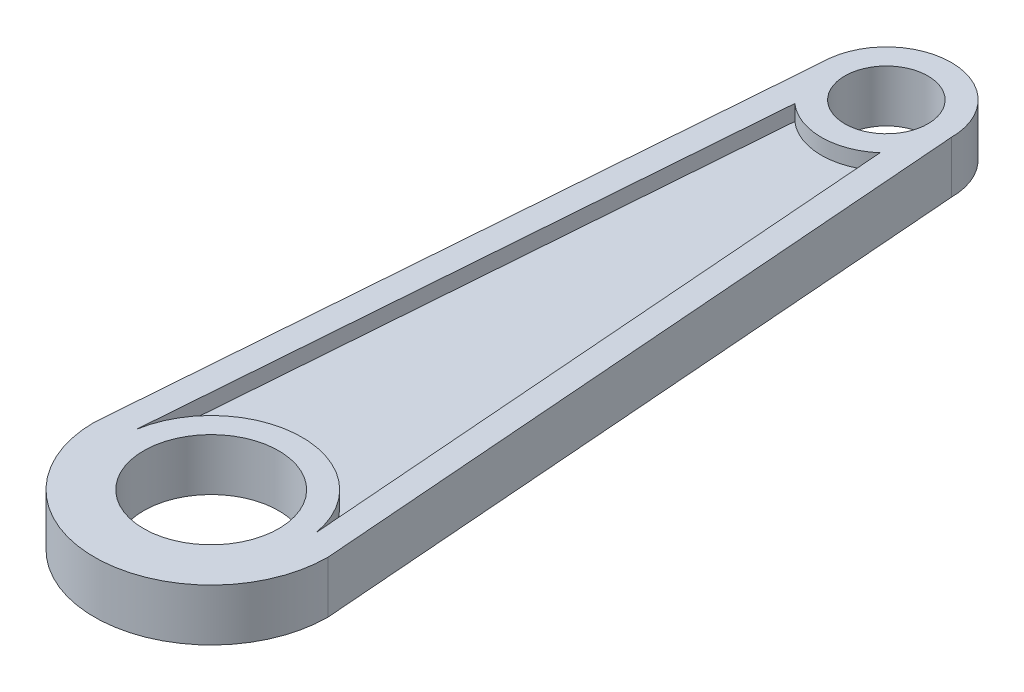
ISO-10303-21;
HEADER;
FILE_DESCRIPTION(('STEP AP214'),'2;1');
FILE_NAME('part.step','',(''),(''),'','','');
FILE_SCHEMA(('AUTOMOTIVE_DESIGN { 1 0 10303 214 1 1 1 1 }'));
ENDSEC;
DATA;
#1=APPLICATION_CONTEXT('core data for automotive mechanical design processes');
#2=APPLICATION_PROTOCOL_DEFINITION('international standard','automotive_design',2000,#1);
#3=PRODUCT_CONTEXT('',#1,'mechanical');
#4=PRODUCT('Part','Part','',(#3));
#5=PRODUCT_RELATED_PRODUCT_CATEGORY('part','',(#4));
#6=PRODUCT_DEFINITION_FORMATION('','',#4);
#7=PRODUCT_DEFINITION_CONTEXT('part definition',#1,'design');
#8=PRODUCT_DEFINITION('design','',#6,#7);
#9=PRODUCT_DEFINITION_SHAPE('','',#8);
#10=(LENGTH_UNIT() NAMED_UNIT(*) SI_UNIT(.MILLI.,.METRE.));
#11=(NAMED_UNIT(*) PLANE_ANGLE_UNIT() SI_UNIT($,.RADIAN.));
#12=(NAMED_UNIT(*) SI_UNIT($,.STERADIAN.) SOLID_ANGLE_UNIT());
#13=UNCERTAINTY_MEASURE_WITH_UNIT(LENGTH_MEASURE(1.E-05),#10,'distance_accuracy_value','');
#14=(GEOMETRIC_REPRESENTATION_CONTEXT(3) GLOBAL_UNCERTAINTY_ASSIGNED_CONTEXT((#13)) GLOBAL_UNIT_ASSIGNED_CONTEXT((#10,
#11,#12)) REPRESENTATION_CONTEXT('',''));
#15=CARTESIAN_POINT('',(0.,0.,0.));
#16=DIRECTION('',(0.,0.,1.));
#17=DIRECTION('',(1.,0.,0.));
#18=AXIS2_PLACEMENT_3D('',#15,#16,#17);
#19=CARTESIAN_POINT('',(0.,5.,0.));
#20=DIRECTION('',(0.,1.,0.));
#21=DIRECTION('',(0.,0.,1.));
#22=AXIS2_PLACEMENT_3D('',#19,#20,#21);
#23=PLANE('',#22);
#24=CARTESIAN_POINT('',(0.,5.,-130.));
#25=DIRECTION('',(0.,1.,0.));
#26=DIRECTION('',(0.,0.,1.));
#27=AXIS2_PLACEMENT_3D('',#24,#25,#26);
#28=CIRCLE('',#27,12.5);
#29=CARTESIAN_POINT('',(12.5,5.,-130.));
#30=VERTEX_POINT('',#29);
#31=CARTESIAN_POINT('',(-12.5,5.,-130.));
#32=VERTEX_POINT('',#31);
#33=EDGE_CURVE('E179',#30,#32,#28,.T.);
#34=ORIENTED_EDGE('',*,*,#33,.T.);
#35=DIRECTION('',(0.076696498884737,0.,-0.997054485501582));
#36=VECTOR('',#35,1.);
#37=CARTESIAN_POINT('',(-22.3676470588235,5.,-1.72058823529412));
#38=LINE('',#37,#36);
#39=CARTESIAN_POINT('',(-22.5,5.,0.));
#40=VERTEX_POINT('',#39);
#41=EDGE_CURVE('E181',#40,#32,#38,.T.);
#42=ORIENTED_EDGE('',*,*,#41,.F.);
#43=CARTESIAN_POINT('',(0.,5.,0.));
#44=DIRECTION('',(0.,1.,0.));
#45=DIRECTION('',(0.,0.,1.));
#46=AXIS2_PLACEMENT_3D('',#43,#44,#45);
#47=CIRCLE('',#46,22.5);
#48=CARTESIAN_POINT('',(22.5,5.,0.));
#49=VERTEX_POINT('',#48);
#50=EDGE_CURVE('E185',#40,#49,#47,.T.);
#51=ORIENTED_EDGE('',*,*,#50,.T.);
#52=DIRECTION('',(-0.076696498884737,0.,-0.997054485501582));
#53=VECTOR('',#52,1.);
#54=CARTESIAN_POINT('',(22.3676470588235,5.,-1.72058823529412));
#55=LINE('',#54,#53);
#56=EDGE_CURVE('E187',#49,#30,#55,.T.);
#57=ORIENTED_EDGE('',*,*,#56,.T.);
#58=EDGE_LOOP('',(#34,#42,#51,#57));
#59=FACE_BOUND('',#58,.T.);
#60=CARTESIAN_POINT('',(0.,5.,0.));
#61=DIRECTION('',(0.,1.,0.));
#62=DIRECTION('',(0.,0.,1.));
#63=AXIS2_PLACEMENT_3D('',#60,#61,#62);
#64=CIRCLE('',#63,13.);
#65=CARTESIAN_POINT('',(0.,5.,13.));
#66=VERTEX_POINT('',#65);
#67=EDGE_CURVE('E189',#66,#66,#64,.T.);
#68=ORIENTED_EDGE('',*,*,#67,.F.);
#69=EDGE_LOOP('',(#68));
#70=FACE_BOUND('',#69,.T.);
#71=CARTESIAN_POINT('',(0.,5.,-130.));
#72=DIRECTION('',(0.,1.,0.));
#73=DIRECTION('',(0.,0.,1.));
#74=AXIS2_PLACEMENT_3D('',#71,#72,#73);
#75=CIRCLE('',#74,8.);
#76=CARTESIAN_POINT('',(0.,5.,-122.));
#77=VERTEX_POINT('',#76);
#78=EDGE_CURVE('E192',#77,#77,#75,.T.);
#79=ORIENTED_EDGE('',*,*,#78,.F.);
#80=EDGE_LOOP('',(#79));
#81=FACE_BOUND('',#80,.T.);
#82=CARTESIAN_POINT('',(0.,5.,-130.));
#83=DIRECTION('',(0.,1.,0.));
#84=DIRECTION('',(0.,0.,1.));
#85=AXIS2_PLACEMENT_3D('',#82,#83,#84);
#86=CIRCLE('',#85,12.5);
#87=CARTESIAN_POINT('',(-8.21027296139896,5.,-120.574427449787));
#88=VERTEX_POINT('',#87);
#89=CARTESIAN_POINT('',(8.21027296139896,5.,-120.574427449787));
#90=VERTEX_POINT('',#89);
#91=EDGE_CURVE('E139',#88,#90,#86,.T.);
#92=ORIENTED_EDGE('',*,*,#91,.T.);
#93=DIRECTION('',(0.076696498884737,0.,0.997054485501582));
#94=VECTOR('',#93,1.);
#95=CARTESIAN_POINT('',(17.3823746313156,5.,-1.33710574087043));
#96=LINE('',#95,#94);
#97=CARTESIAN_POINT('',(17.2656749056663,5.,-2.85420217431153));
#98=VERTEX_POINT('',#97);
#99=EDGE_CURVE('E50',#90,#98,#96,.T.);
#100=ORIENTED_EDGE('',*,*,#99,.T.);
#101=CARTESIAN_POINT('',(0.,5.,0.));
#102=DIRECTION('',(0.,1.,0.));
#103=DIRECTION('',(0.,0.,1.));
#104=AXIS2_PLACEMENT_3D('',#101,#102,#103);
#105=CIRCLE('',#104,17.5);
#106=CARTESIAN_POINT('',(-17.2656749056663,5.,-2.85420217431153));
#107=VERTEX_POINT('',#106);
#108=EDGE_CURVE('E143',#98,#107,#105,.T.);
#109=ORIENTED_EDGE('',*,*,#108,.T.);
#110=DIRECTION('',(0.076696498884737,0.,-0.997054485501582));
#111=VECTOR('',#110,1.);
#112=CARTESIAN_POINT('',(-17.3823746313156,5.,-1.33710574087043));
#113=LINE('',#112,#111);
#114=EDGE_CURVE('E247',#107,#88,#113,.T.);
#115=ORIENTED_EDGE('',*,*,#114,.T.);
#116=EDGE_LOOP('',(#92,#100,#109,#115));
#117=FACE_BOUND('',#116,.T.);
#118=ADVANCED_FACE('F35',(#59,#70,#81,#117),#23,.T.);
#119=CARTESIAN_POINT('',(0.,5.,-130.));
#120=DIRECTION('',(0.,-1.,0.));
#121=DIRECTION('',(0.,0.,-1.));
#122=AXIS2_PLACEMENT_3D('',#119,#120,#121);
#123=CYLINDRICAL_SURFACE('',#122,12.5);
#124=CARTESIAN_POINT('',(0.,-5.,-130.));
#125=DIRECTION('',(0.,1.,0.));
#126=DIRECTION('',(0.,0.,1.));
#127=AXIS2_PLACEMENT_3D('',#124,#125,#126);
#128=CIRCLE('',#127,12.5);
#129=CARTESIAN_POINT('',(12.5,-5.,-130.));
#130=VERTEX_POINT('',#129);
#131=CARTESIAN_POINT('',(-12.5,-5.,-130.));
#132=VERTEX_POINT('',#131);
#133=EDGE_CURVE('E173',#130,#132,#128,.T.);
#134=ORIENTED_EDGE('',*,*,#133,.T.);
#135=DIRECTION('',(0.,-1.,0.));
#136=VECTOR('',#135,1.);
#137=CARTESIAN_POINT('',(-12.5,5.,-130.));
#138=LINE('',#137,#136);
#139=EDGE_CURVE('E11',#32,#132,#138,.T.);
#140=ORIENTED_EDGE('',*,*,#139,.F.);
#141=ORIENTED_EDGE('',*,*,#33,.F.);
#142=DIRECTION('',(0.,-1.,0.));
#143=VECTOR('',#142,1.);
#144=CARTESIAN_POINT('',(12.5,5.,-130.));
#145=LINE('',#144,#143);
#146=EDGE_CURVE('E195',#30,#130,#145,.T.);
#147=ORIENTED_EDGE('',*,*,#146,.T.);
#148=EDGE_LOOP('',(#134,#140,#141,#147));
#149=FACE_BOUND('',#148,.T.);
#150=ADVANCED_FACE('F37',(#149),#123,.T.);
#151=CARTESIAN_POINT('',(-22.3676470588235,5.,-1.72058823529412));
#152=DIRECTION('',(-0.997054485501582,0.,-0.076696498884737));
#153=DIRECTION('',(-0.076696498884737,0.,0.997054485501582));
#154=AXIS2_PLACEMENT_3D('',#151,#152,#153);
#155=PLANE('',#154);
#156=DIRECTION('',(0.076696498884737,0.,-0.997054485501582));
#157=VECTOR('',#156,1.);
#158=CARTESIAN_POINT('',(-22.3676470588235,-5.,-1.72058823529412));
#159=LINE('',#158,#157);
#160=CARTESIAN_POINT('',(-22.5,-5.,0.));
#161=VERTEX_POINT('',#160);
#162=EDGE_CURVE('E198',#161,#132,#159,.T.);
#163=ORIENTED_EDGE('',*,*,#162,.F.);
#164=DIRECTION('',(0.,-1.,0.));
#165=VECTOR('',#164,1.);
#166=CARTESIAN_POINT('',(-22.5,5.,0.));
#167=LINE('',#166,#165);
#168=EDGE_CURVE('E43',#40,#161,#167,.T.);
#169=ORIENTED_EDGE('',*,*,#168,.F.);
#170=ORIENTED_EDGE('',*,*,#41,.T.);
#171=ORIENTED_EDGE('',*,*,#139,.T.);
#172=EDGE_LOOP('',(#163,#169,#170,#171));
#173=FACE_BOUND('',#172,.T.);
#174=ADVANCED_FACE('F227',(#173),#155,.T.);
#175=CARTESIAN_POINT('',(0.,5.,0.));
#176=DIRECTION('',(0.,-1.,0.));
#177=DIRECTION('',(0.,0.,-1.));
#178=AXIS2_PLACEMENT_3D('',#175,#176,#177);
#179=CYLINDRICAL_SURFACE('',#178,22.5);
#180=CARTESIAN_POINT('',(0.,-5.,0.));
#181=DIRECTION('',(0.,1.,0.));
#182=DIRECTION('',(0.,0.,1.));
#183=AXIS2_PLACEMENT_3D('',#180,#181,#182);
#184=CIRCLE('',#183,22.5);
#185=CARTESIAN_POINT('',(22.5,-5.,0.));
#186=VERTEX_POINT('',#185);
#187=EDGE_CURVE('E201',#161,#186,#184,.T.);
#188=ORIENTED_EDGE('',*,*,#187,.T.);
#189=DIRECTION('',(0.,-1.,0.));
#190=VECTOR('',#189,1.);
#191=CARTESIAN_POINT('',(22.5,5.,0.));
#192=LINE('',#191,#190);
#193=EDGE_CURVE('E212',#49,#186,#192,.T.);
#194=ORIENTED_EDGE('',*,*,#193,.F.);
#195=ORIENTED_EDGE('',*,*,#50,.F.);
#196=ORIENTED_EDGE('',*,*,#168,.T.);
#197=EDGE_LOOP('',(#188,#194,#195,#196));
#198=FACE_BOUND('',#197,.T.);
#199=ADVANCED_FACE('F217',(#198),#179,.T.);
#200=CARTESIAN_POINT('',(0.,5.,0.));
#201=DIRECTION('',(0.,-1.,0.));
#202=DIRECTION('',(0.,0.,-1.));
#203=AXIS2_PLACEMENT_3D('',#200,#201,#202);
#204=CYLINDRICAL_SURFACE('',#203,13.);
#205=ORIENTED_EDGE('',*,*,#67,.T.);
#206=EDGE_LOOP('',(#205));
#207=FACE_BOUND('',#206,.T.);
#208=CARTESIAN_POINT('',(0.,-5.,0.));
#209=DIRECTION('',(0.,1.,0.));
#210=DIRECTION('',(0.,0.,1.));
#211=AXIS2_PLACEMENT_3D('',#208,#209,#210);
#212=CIRCLE('',#211,13.);
#213=CARTESIAN_POINT('',(0.,-5.,13.));
#214=VERTEX_POINT('',#213);
#215=EDGE_CURVE('E205',#214,#214,#212,.T.);
#216=ORIENTED_EDGE('',*,*,#215,.F.);
#217=EDGE_LOOP('',(#216));
#218=FACE_BOUND('',#217,.T.);
#219=ADVANCED_FACE('F300',(#207,#218),#204,.F.);
#220=CARTESIAN_POINT('',(22.3676470588235,5.,-1.72058823529412));
#221=DIRECTION('',(-0.997054485501582,0.,0.076696498884737));
#222=DIRECTION('',(0.076696498884737,0.,0.997054485501582));
#223=AXIS2_PLACEMENT_3D('',#220,#221,#222);
#224=PLANE('',#223);
#225=DIRECTION('',(-0.076696498884737,0.,-0.997054485501582));
#226=VECTOR('',#225,1.);
#227=CARTESIAN_POINT('',(22.3676470588235,-5.,-1.72058823529412));
#228=LINE('',#227,#226);
#229=EDGE_CURVE('E203',#186,#130,#228,.T.);
#230=ORIENTED_EDGE('',*,*,#229,.T.);
#231=ORIENTED_EDGE('',*,*,#146,.F.);
#232=ORIENTED_EDGE('',*,*,#56,.F.);
#233=ORIENTED_EDGE('',*,*,#193,.T.);
#234=EDGE_LOOP('',(#230,#231,#232,#233));
#235=FACE_BOUND('',#234,.T.);
#236=ADVANCED_FACE('F234',(#235),#224,.F.);
#237=CARTESIAN_POINT('',(0.,5.,-130.));
#238=DIRECTION('',(0.,-1.,0.));
#239=DIRECTION('',(0.,0.,-1.));
#240=AXIS2_PLACEMENT_3D('',#237,#238,#239);
#241=CYLINDRICAL_SURFACE('',#240,8.);
#242=ORIENTED_EDGE('',*,*,#78,.T.);
#243=EDGE_LOOP('',(#242));
#244=FACE_BOUND('',#243,.T.);
#245=CARTESIAN_POINT('',(0.,-5.,-130.));
#246=DIRECTION('',(0.,1.,0.));
#247=DIRECTION('',(0.,0.,1.));
#248=AXIS2_PLACEMENT_3D('',#245,#246,#247);
#249=CIRCLE('',#248,8.);
#250=CARTESIAN_POINT('',(0.,-5.,-122.));
#251=VERTEX_POINT('',#250);
#252=EDGE_CURVE('E182',#251,#251,#249,.T.);
#253=ORIENTED_EDGE('',*,*,#252,.F.);
#254=EDGE_LOOP('',(#253));
#255=FACE_BOUND('',#254,.T.);
#256=ADVANCED_FACE('F295',(#244,#255),#241,.F.);
#257=CARTESIAN_POINT('',(0.,-5.,0.));
#258=DIRECTION('',(0.,1.,0.));
#259=DIRECTION('',(0.,0.,1.));
#260=AXIS2_PLACEMENT_3D('',#257,#258,#259);
#261=PLANE('',#260);
#262=DIRECTION('',(-0.076696498884737,0.,-0.997054485501582));
#263=VECTOR('',#262,1.);
#264=CARTESIAN_POINT('',(17.3823746313156,-5.,-1.33710574087043));
#265=LINE('',#264,#263);
#266=CARTESIAN_POINT('',(17.2656749056663,-5.,-2.85420217431153));
#267=VERTEX_POINT('',#266);
#268=CARTESIAN_POINT('',(8.21027296139894,-5.,-120.574427449787));
#269=VERTEX_POINT('',#268);
#270=EDGE_CURVE('E146',#267,#269,#265,.T.);
#271=ORIENTED_EDGE('',*,*,#270,.T.);
#272=CARTESIAN_POINT('',(0.,-5.,-130.));
#273=DIRECTION('',(0.,1.,0.));
#274=DIRECTION('',(0.,0.,1.));
#275=AXIS2_PLACEMENT_3D('',#272,#273,#274);
#276=CIRCLE('',#275,12.5);
#277=CARTESIAN_POINT('',(-8.21027296139894,-5.,-120.574427449787));
#278=VERTEX_POINT('',#277);
#279=EDGE_CURVE('E58',#278,#269,#276,.T.);
#280=ORIENTED_EDGE('',*,*,#279,.F.);
#281=DIRECTION('',(-0.076696498884737,0.,0.997054485501582));
#282=VECTOR('',#281,1.);
#283=CARTESIAN_POINT('',(-17.3823746313156,-5.,-1.33710574087043));
#284=LINE('',#283,#282);
#285=CARTESIAN_POINT('',(-17.2656749056663,-5.,-2.85420217431153));
#286=VERTEX_POINT('',#285);
#287=EDGE_CURVE('E156',#278,#286,#284,.T.);
#288=ORIENTED_EDGE('',*,*,#287,.T.);
#289=CARTESIAN_POINT('',(0.,-5.,0.));
#290=DIRECTION('',(0.,1.,0.));
#291=DIRECTION('',(0.,0.,1.));
#292=AXIS2_PLACEMENT_3D('',#289,#290,#291);
#293=CIRCLE('',#292,17.5);
#294=EDGE_CURVE('E166',#267,#286,#293,.T.);
#295=ORIENTED_EDGE('',*,*,#294,.F.);
#296=EDGE_LOOP('',(#271,#280,#288,#295));
#297=FACE_BOUND('',#296,.T.);
#298=ORIENTED_EDGE('',*,*,#133,.F.);
#299=ORIENTED_EDGE('',*,*,#229,.F.);
#300=ORIENTED_EDGE('',*,*,#187,.F.);
#301=ORIENTED_EDGE('',*,*,#162,.T.);
#302=EDGE_LOOP('',(#298,#299,#300,#301));
#303=FACE_BOUND('',#302,.T.);
#304=ORIENTED_EDGE('',*,*,#215,.T.);
#305=EDGE_LOOP('',(#304));
#306=FACE_BOUND('',#305,.T.);
#307=ORIENTED_EDGE('',*,*,#252,.T.);
#308=EDGE_LOOP('',(#307));
#309=FACE_BOUND('',#308,.T.);
#310=ADVANCED_FACE('F225',(#297,#303,#306,#309),#261,.F.);
#311=CARTESIAN_POINT('',(0.,-2.,-130.));
#312=DIRECTION('',(0.,-1.,0.));
#313=DIRECTION('',(0.,0.,-1.));
#314=AXIS2_PLACEMENT_3D('',#311,#312,#313);
#315=CYLINDRICAL_SURFACE('',#314,12.5);
#316=ORIENTED_EDGE('',*,*,#279,.T.);
#317=DIRECTION('',(0.,-1.,0.));
#318=VECTOR('',#317,1.);
#319=CARTESIAN_POINT('',(8.21027296139894,-2.,-120.574427449787));
#320=LINE('',#319,#318);
#321=CARTESIAN_POINT('',(8.21027296139894,-2.,-120.574427449787));
#322=VERTEX_POINT('',#321);
#323=EDGE_CURVE('E162',#322,#269,#320,.T.);
#324=ORIENTED_EDGE('',*,*,#323,.F.);
#325=CARTESIAN_POINT('',(0.,-2.,-130.));
#326=DIRECTION('',(0.,1.,0.));
#327=DIRECTION('',(0.,0.,1.));
#328=AXIS2_PLACEMENT_3D('',#325,#326,#327);
#329=CIRCLE('',#328,12.5);
#330=CARTESIAN_POINT('',(-8.21027296139894,-2.,-120.574427449787));
#331=VERTEX_POINT('',#330);
#332=EDGE_CURVE('E152',#331,#322,#329,.T.);
#333=ORIENTED_EDGE('',*,*,#332,.F.);
#334=DIRECTION('',(0.,-1.,0.));
#335=VECTOR('',#334,1.);
#336=CARTESIAN_POINT('',(-8.21027296139894,-2.,-120.574427449787));
#337=LINE('',#336,#335);
#338=EDGE_CURVE('E171',#331,#278,#337,.T.);
#339=ORIENTED_EDGE('',*,*,#338,.T.);
#340=EDGE_LOOP('',(#316,#324,#333,#339));
#341=FACE_BOUND('',#340,.T.);
#342=ADVANCED_FACE('F283',(#341),#315,.T.);
#343=CARTESIAN_POINT('',(-17.3823746313156,-2.,-1.33710574087043));
#344=DIRECTION('',(0.997054485501581,0.,0.076696498884737));
#345=DIRECTION('',(0.076696498884737,0.,-0.997054485501582));
#346=AXIS2_PLACEMENT_3D('',#343,#344,#345);
#347=PLANE('',#346);
#348=ORIENTED_EDGE('',*,*,#287,.F.);
#349=ORIENTED_EDGE('',*,*,#338,.F.);
#350=DIRECTION('',(-0.076696498884737,0.,0.997054485501582));
#351=VECTOR('',#350,1.);
#352=CARTESIAN_POINT('',(-17.3823746313156,-2.,-1.33710574087043));
#353=LINE('',#352,#351);
#354=CARTESIAN_POINT('',(-17.2656749056663,-2.,-2.85420217431153));
#355=VERTEX_POINT('',#354);
#356=EDGE_CURVE('E161',#331,#355,#353,.T.);
#357=ORIENTED_EDGE('',*,*,#356,.T.);
#358=DIRECTION('',(0.,-1.,0.));
#359=VECTOR('',#358,1.);
#360=CARTESIAN_POINT('',(-17.2656749056663,-2.,-2.85420217431153));
#361=LINE('',#360,#359);
#362=EDGE_CURVE('E174',#355,#286,#361,.T.);
#363=ORIENTED_EDGE('',*,*,#362,.T.);
#364=EDGE_LOOP('',(#348,#349,#357,#363));
#365=FACE_BOUND('',#364,.T.);
#366=ADVANCED_FACE('F279',(#365),#347,.T.);
#367=CARTESIAN_POINT('',(0.,-2.,0.));
#368=DIRECTION('',(0.,-1.,0.));
#369=DIRECTION('',(0.,0.,-1.));
#370=AXIS2_PLACEMENT_3D('',#367,#368,#369);
#371=CYLINDRICAL_SURFACE('',#370,17.5);
#372=ORIENTED_EDGE('',*,*,#294,.T.);
#373=ORIENTED_EDGE('',*,*,#362,.F.);
#374=CARTESIAN_POINT('',(0.,-2.,0.));
#375=DIRECTION('',(0.,1.,0.));
#376=DIRECTION('',(0.,0.,1.));
#377=AXIS2_PLACEMENT_3D('',#374,#375,#376);
#378=CIRCLE('',#377,17.5);
#379=CARTESIAN_POINT('',(17.2656749056663,-2.,-2.85420217431153));
#380=VERTEX_POINT('',#379);
#381=EDGE_CURVE('E158',#380,#355,#378,.T.);
#382=ORIENTED_EDGE('',*,*,#381,.F.);
#383=DIRECTION('',(0.,-1.,0.));
#384=VECTOR('',#383,1.);
#385=CARTESIAN_POINT('',(17.2656749056663,-2.,-2.85420217431153));
#386=LINE('',#385,#384);
#387=EDGE_CURVE('E176',#380,#267,#386,.T.);
#388=ORIENTED_EDGE('',*,*,#387,.T.);
#389=EDGE_LOOP('',(#372,#373,#382,#388));
#390=FACE_BOUND('',#389,.T.);
#391=ADVANCED_FACE('F282',(#390),#371,.T.);
#392=CARTESIAN_POINT('',(17.3823746313156,-2.,-1.33710574087043));
#393=DIRECTION('',(-0.997054485501582,0.,0.076696498884737));
#394=DIRECTION('',(0.076696498884737,0.,0.997054485501582));
#395=AXIS2_PLACEMENT_3D('',#392,#393,#394);
#396=PLANE('',#395);
#397=ORIENTED_EDGE('',*,*,#270,.F.);
#398=ORIENTED_EDGE('',*,*,#387,.F.);
#399=DIRECTION('',(-0.076696498884737,0.,-0.997054485501582));
#400=VECTOR('',#399,1.);
#401=CARTESIAN_POINT('',(17.3823746313156,-2.,-1.33710574087043));
#402=LINE('',#401,#400);
#403=EDGE_CURVE('E155',#380,#322,#402,.T.);
#404=ORIENTED_EDGE('',*,*,#403,.T.);
#405=ORIENTED_EDGE('',*,*,#323,.T.);
#406=EDGE_LOOP('',(#397,#398,#404,#405));
#407=FACE_BOUND('',#406,.T.);
#408=ADVANCED_FACE('F277',(#407),#396,.T.);
#409=CARTESIAN_POINT('',(0.,-2.,-130.));
#410=DIRECTION('',(0.,1.,0.));
#411=DIRECTION('',(0.,0.,1.));
#412=AXIS2_PLACEMENT_3D('',#409,#410,#411);
#413=PLANE('',#412);
#414=ORIENTED_EDGE('',*,*,#332,.T.);
#415=ORIENTED_EDGE('',*,*,#403,.F.);
#416=ORIENTED_EDGE('',*,*,#381,.T.);
#417=ORIENTED_EDGE('',*,*,#356,.F.);
#418=EDGE_LOOP('',(#414,#415,#416,#417));
#419=FACE_BOUND('',#418,.T.);
#420=ADVANCED_FACE('F274',(#419),#413,.F.);
#421=CARTESIAN_POINT('',(17.3823746313156,2.,-1.33710574087043));
#422=DIRECTION('',(-0.997054485501582,0.,0.076696498884737));
#423=DIRECTION('',(0.076696498884737,0.,0.997054485501582));
#424=AXIS2_PLACEMENT_3D('',#421,#422,#423);
#425=PLANE('',#424);
#426=ORIENTED_EDGE('',*,*,#99,.F.);
#427=DIRECTION('',(0.,1.,0.));
#428=VECTOR('',#427,1.);
#429=CARTESIAN_POINT('',(8.21027296139896,2.,-120.574427449787));
#430=LINE('',#429,#428);
#431=CARTESIAN_POINT('',(8.21027296139896,2.,-120.574427449787));
#432=VERTEX_POINT('',#431);
#433=EDGE_CURVE('E138',#432,#90,#430,.T.);
#434=ORIENTED_EDGE('',*,*,#433,.F.);
#435=DIRECTION('',(0.076696498884737,0.,0.997054485501582));
#436=VECTOR('',#435,1.);
#437=CARTESIAN_POINT('',(17.3823746313156,2.,-1.33710574087043));
#438=LINE('',#437,#436);
#439=CARTESIAN_POINT('',(17.2656749056663,2.,-2.85420217431153));
#440=VERTEX_POINT('',#439);
#441=EDGE_CURVE('E130',#432,#440,#438,.T.);
#442=ORIENTED_EDGE('',*,*,#441,.T.);
#443=DIRECTION('',(0.,1.,0.));
#444=VECTOR('',#443,1.);
#445=CARTESIAN_POINT('',(17.2656749056663,2.,-2.85420217431153));
#446=LINE('',#445,#444);
#447=EDGE_CURVE('E137',#440,#98,#446,.T.);
#448=ORIENTED_EDGE('',*,*,#447,.T.);
#449=EDGE_LOOP('',(#426,#434,#442,#448));
#450=FACE_BOUND('',#449,.T.);
#451=ADVANCED_FACE('F136',(#450),#425,.T.);
#452=CARTESIAN_POINT('',(0.,2.,0.));
#453=DIRECTION('',(0.,1.,0.));
#454=DIRECTION('',(0.,0.,1.));
#455=AXIS2_PLACEMENT_3D('',#452,#453,#454);
#456=CYLINDRICAL_SURFACE('',#455,17.5);
#457=ORIENTED_EDGE('',*,*,#108,.F.);
#458=ORIENTED_EDGE('',*,*,#447,.F.);
#459=CARTESIAN_POINT('',(0.,2.,0.));
#460=DIRECTION('',(0.,1.,0.));
#461=DIRECTION('',(0.,0.,1.));
#462=AXIS2_PLACEMENT_3D('',#459,#460,#461);
#463=CIRCLE('',#462,17.5);
#464=CARTESIAN_POINT('',(-17.2656749056663,2.,-2.85420217431153));
#465=VERTEX_POINT('',#464);
#466=EDGE_CURVE('E126',#440,#465,#463,.T.);
#467=ORIENTED_EDGE('',*,*,#466,.T.);
#468=DIRECTION('',(0.,1.,0.));
#469=VECTOR('',#468,1.);
#470=CARTESIAN_POINT('',(-17.2656749056663,2.,-2.85420217431153));
#471=LINE('',#470,#469);
#472=EDGE_CURVE('E144',#465,#107,#471,.T.);
#473=ORIENTED_EDGE('',*,*,#472,.T.);
#474=EDGE_LOOP('',(#457,#458,#467,#473));
#475=FACE_BOUND('',#474,.T.);
#476=ADVANCED_FACE('F141',(#475),#456,.T.);
#477=CARTESIAN_POINT('',(-17.3823746313156,2.,-1.33710574087043));
#478=DIRECTION('',(0.997054485501581,0.,0.076696498884737));
#479=DIRECTION('',(0.076696498884737,0.,-0.997054485501582));
#480=AXIS2_PLACEMENT_3D('',#477,#478,#479);
#481=PLANE('',#480);
#482=ORIENTED_EDGE('',*,*,#114,.F.);
#483=ORIENTED_EDGE('',*,*,#472,.F.);
#484=DIRECTION('',(0.076696498884737,0.,-0.997054485501582));
#485=VECTOR('',#484,1.);
#486=CARTESIAN_POINT('',(-17.3823746313156,2.,-1.33710574087043));
#487=LINE('',#486,#485);
#488=CARTESIAN_POINT('',(-8.21027296139896,2.,-120.574427449787));
#489=VERTEX_POINT('',#488);
#490=EDGE_CURVE('E131',#465,#489,#487,.T.);
#491=ORIENTED_EDGE('',*,*,#490,.T.);
#492=DIRECTION('',(0.,1.,0.));
#493=VECTOR('',#492,1.);
#494=CARTESIAN_POINT('',(-8.21027296139896,2.,-120.574427449787));
#495=LINE('',#494,#493);
#496=EDGE_CURVE('E148',#489,#88,#495,.T.);
#497=ORIENTED_EDGE('',*,*,#496,.T.);
#498=EDGE_LOOP('',(#482,#483,#491,#497));
#499=FACE_BOUND('',#498,.T.);
#500=ADVANCED_FACE('F256',(#499),#481,.T.);
#501=CARTESIAN_POINT('',(0.,2.,-130.));
#502=DIRECTION('',(0.,1.,0.));
#503=DIRECTION('',(0.,0.,1.));
#504=AXIS2_PLACEMENT_3D('',#501,#502,#503);
#505=CYLINDRICAL_SURFACE('',#504,12.5);
#506=ORIENTED_EDGE('',*,*,#91,.F.);
#507=ORIENTED_EDGE('',*,*,#496,.F.);
#508=CARTESIAN_POINT('',(0.,2.,-130.));
#509=DIRECTION('',(0.,1.,0.));
#510=DIRECTION('',(0.,0.,1.));
#511=AXIS2_PLACEMENT_3D('',#508,#509,#510);
#512=CIRCLE('',#511,12.5);
#513=EDGE_CURVE('E254',#489,#432,#512,.T.);
#514=ORIENTED_EDGE('',*,*,#513,.T.);
#515=ORIENTED_EDGE('',*,*,#433,.T.);
#516=EDGE_LOOP('',(#506,#507,#514,#515));
#517=FACE_BOUND('',#516,.T.);
#518=ADVANCED_FACE('F257',(#517),#505,.T.);
#519=CARTESIAN_POINT('',(0.,2.,0.));
#520=DIRECTION('',(0.,1.,0.));
#521=DIRECTION('',(0.,0.,1.));
#522=AXIS2_PLACEMENT_3D('',#519,#520,#521);
#523=PLANE('',#522);
#524=ORIENTED_EDGE('',*,*,#441,.F.);
#525=ORIENTED_EDGE('',*,*,#513,.F.);
#526=ORIENTED_EDGE('',*,*,#490,.F.);
#527=ORIENTED_EDGE('',*,*,#466,.F.);
#528=EDGE_LOOP('',(#524,#525,#526,#527));
#529=FACE_BOUND('',#528,.T.);
#530=ADVANCED_FACE('F128',(#529),#523,.T.);
#531=CLOSED_SHELL('',(#118,#150,#174,#199,#219,#236,#256,#310,#342,#366,#391,#408,#420,#451,
#476,#500,#518,#530));
#532=MANIFOLD_SOLID_BREP('B2',#531);
#533=ADVANCED_BREP_SHAPE_REPRESENTATION('',(#18,#532),#14);
#534=SHAPE_DEFINITION_REPRESENTATION(#9,#533);
ENDSEC;
END-ISO-10303-21;
